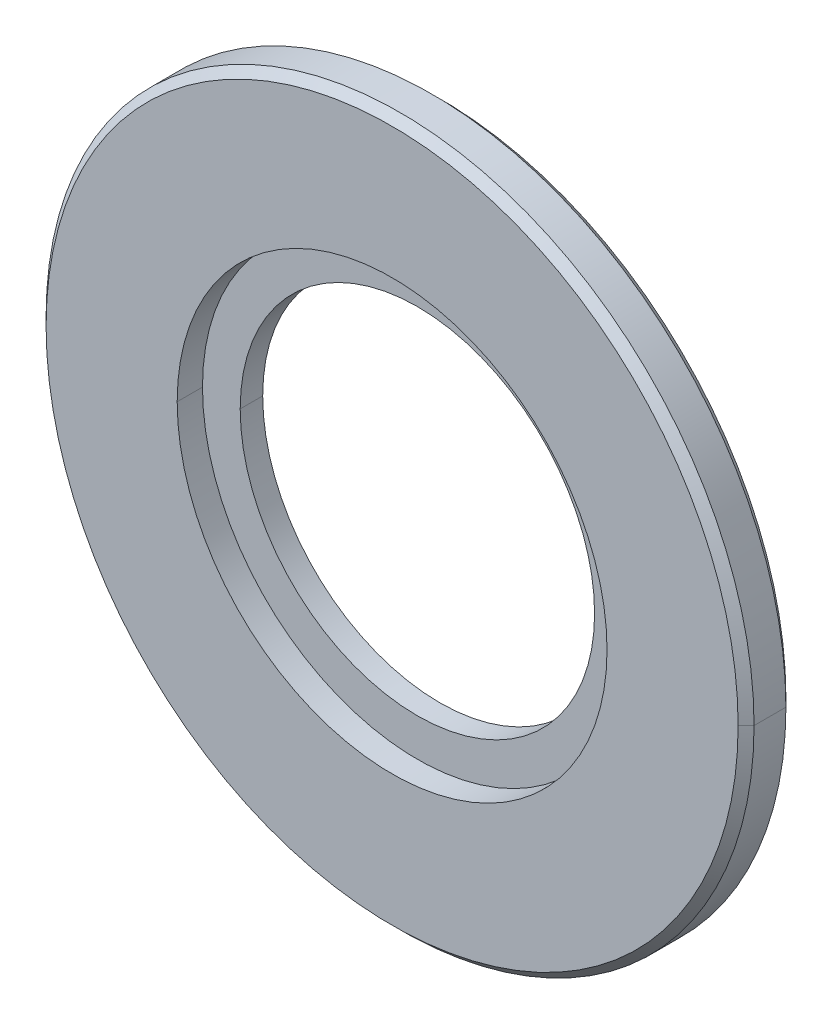
ISO-10303-21;
HEADER;
FILE_DESCRIPTION(('STEP AP214'),'2;1');
FILE_NAME('part.step','',(''),(''),'','','');
FILE_SCHEMA(('AUTOMOTIVE_DESIGN { 1 0 10303 214 1 1 1 1 }'));
ENDSEC;
DATA;
#1=APPLICATION_CONTEXT('core data for automotive mechanical design processes');
#2=APPLICATION_PROTOCOL_DEFINITION('international standard','automotive_design',2000,#1);
#3=PRODUCT_CONTEXT('',#1,'mechanical');
#4=PRODUCT('Part','Part','',(#3));
#5=PRODUCT_RELATED_PRODUCT_CATEGORY('part','',(#4));
#6=PRODUCT_DEFINITION_FORMATION('','',#4);
#7=PRODUCT_DEFINITION_CONTEXT('part definition',#1,'design');
#8=PRODUCT_DEFINITION('design','',#6,#7);
#9=PRODUCT_DEFINITION_SHAPE('','',#8);
#10=(LENGTH_UNIT() NAMED_UNIT(*) SI_UNIT(.MILLI.,.METRE.));
#11=(NAMED_UNIT(*) PLANE_ANGLE_UNIT() SI_UNIT($,.RADIAN.));
#12=(NAMED_UNIT(*) SI_UNIT($,.STERADIAN.) SOLID_ANGLE_UNIT());
#13=UNCERTAINTY_MEASURE_WITH_UNIT(LENGTH_MEASURE(1.E-05),#10,'distance_accuracy_value','');
#14=(GEOMETRIC_REPRESENTATION_CONTEXT(3) GLOBAL_UNCERTAINTY_ASSIGNED_CONTEXT((#13)) GLOBAL_UNIT_ASSIGNED_CONTEXT((#10,
#11,#12)) REPRESENTATION_CONTEXT('',''));
#15=CARTESIAN_POINT('',(0.,0.,0.));
#16=DIRECTION('',(0.,0.,1.));
#17=DIRECTION('',(1.,0.,0.));
#18=AXIS2_PLACEMENT_3D('',#15,#16,#17);
#19=CARTESIAN_POINT('',(0.,0.,0.));
#20=DIRECTION('',(0.,0.,-1.));
#21=DIRECTION('',(-1.,0.,0.));
#22=AXIS2_PLACEMENT_3D('',#19,#20,#21);
#23=CONICAL_SURFACE('',#22,21.7250000000011,0.785398163397448);
#24=DIRECTION('',(0.707106781186573,0.,-0.707106781186522));
#25=VECTOR('',#24,1.);
#26=CARTESIAN_POINT('',(21.7250000000011,0.,0.));
#27=LINE('',#26,#25);
#28=CARTESIAN_POINT('',(21.725,0.,0.));
#29=VERTEX_POINT('',#28);
#30=CARTESIAN_POINT('',(22.2250000000012,0.,-0.499999999999973));
#31=VERTEX_POINT('',#30);
#32=EDGE_CURVE('E146',#29,#31,#27,.T.);
#33=ORIENTED_EDGE('',*,*,#32,.F.);
#34=CARTESIAN_POINT('',(0.,0.,0.));
#35=DIRECTION('',(0.,0.,1.));
#36=DIRECTION('',(1.,0.,0.));
#37=AXIS2_PLACEMENT_3D('',#34,#35,#36);
#38=CIRCLE('',#37,21.7250000000011);
#39=CARTESIAN_POINT('',(-21.725,0.,0.));
#40=VERTEX_POINT('',#39);
#41=EDGE_CURVE('E139',#40,#29,#38,.T.);
#42=ORIENTED_EDGE('',*,*,#41,.F.);
#43=DIRECTION('',(-0.707106781186573,0.,-0.707106781186522));
#44=VECTOR('',#43,1.);
#45=CARTESIAN_POINT('',(-21.7250000000011,0.,0.));
#46=LINE('',#45,#44);
#47=CARTESIAN_POINT('',(-22.225,0.,-0.499999999999973));
#48=VERTEX_POINT('',#47);
#49=EDGE_CURVE('E138',#40,#48,#46,.T.);
#50=ORIENTED_EDGE('',*,*,#49,.T.);
#51=CARTESIAN_POINT('',(0.,0.,-0.499999999999973));
#52=DIRECTION('',(0.,0.,-1.));
#53=DIRECTION('',(1.,0.,0.));
#54=AXIS2_PLACEMENT_3D('',#51,#52,#53);
#55=CIRCLE('',#54,22.2250000000012);
#56=EDGE_CURVE('E11',#31,#48,#55,.T.);
#57=ORIENTED_EDGE('',*,*,#56,.F.);
#58=EDGE_LOOP('',(#33,#42,#50,#57));
#59=FACE_BOUND('',#58,.T.);
#60=ADVANCED_FACE('F16',(#59),#23,.T.);
#61=CARTESIAN_POINT('',(0.,0.,-2.49999999999997));
#62=DIRECTION('',(0.,0.,1.));
#63=DIRECTION('',(1.,0.,0.));
#64=AXIS2_PLACEMENT_3D('',#61,#62,#63);
#65=CONICAL_SURFACE('',#64,22.2250000000012,0.785398163397452);
#66=DIRECTION('',(-0.707106781186576,0.,0.70710678118652));
#67=VECTOR('',#66,1.);
#68=CARTESIAN_POINT('',(-22.2250000000012,0.,-2.49999999999997));
#69=LINE('',#68,#67);
#70=CARTESIAN_POINT('',(-21.725,0.,-3.));
#71=VERTEX_POINT('',#70);
#72=CARTESIAN_POINT('',(-22.225,0.,-2.49999999999997));
#73=VERTEX_POINT('',#72);
#74=EDGE_CURVE('E178',#71,#73,#69,.T.);
#75=ORIENTED_EDGE('',*,*,#74,.F.);
#76=CARTESIAN_POINT('',(0.,0.,-3.));
#77=DIRECTION('',(0.,0.,-1.));
#78=DIRECTION('',(-1.,0.,0.));
#79=AXIS2_PLACEMENT_3D('',#76,#77,#78);
#80=CIRCLE('',#79,21.7250000000011);
#81=CARTESIAN_POINT('',(21.725,0.,-3.));
#82=VERTEX_POINT('',#81);
#83=EDGE_CURVE('E107',#82,#71,#80,.T.);
#84=ORIENTED_EDGE('',*,*,#83,.F.);
#85=DIRECTION('',(0.707106781186576,0.,0.70710678118652));
#86=VECTOR('',#85,1.);
#87=CARTESIAN_POINT('',(22.2250000000012,0.,-2.49999999999997));
#88=LINE('',#87,#86);
#89=CARTESIAN_POINT('',(22.225,0.,-2.49999999999997));
#90=VERTEX_POINT('',#89);
#91=EDGE_CURVE('E134',#82,#90,#88,.T.);
#92=ORIENTED_EDGE('',*,*,#91,.T.);
#93=CARTESIAN_POINT('',(0.,0.,-2.49999999999997));
#94=DIRECTION('',(0.,0.,1.));
#95=DIRECTION('',(-1.,0.,0.));
#96=AXIS2_PLACEMENT_3D('',#93,#94,#95);
#97=CIRCLE('',#96,22.2250000000012);
#98=EDGE_CURVE('E27',#73,#90,#97,.T.);
#99=ORIENTED_EDGE('',*,*,#98,.F.);
#100=EDGE_LOOP('',(#75,#84,#92,#99));
#101=FACE_BOUND('',#100,.T.);
#102=ADVANCED_FACE('F253',(#101),#65,.T.);
#103=CARTESIAN_POINT('',(0.,0.,0.));
#104=DIRECTION('',(0.,0.,1.));
#105=DIRECTION('',(1.,0.,0.));
#106=AXIS2_PLACEMENT_3D('',#103,#104,#105);
#107=CYLINDRICAL_SURFACE('',#106,22.2250000000012);
#108=DIRECTION('',(0.,0.,1.));
#109=VECTOR('',#108,1.);
#110=CARTESIAN_POINT('',(-22.2250000000012,0.,0.));
#111=LINE('',#110,#109);
#112=EDGE_CURVE('E117',#73,#48,#111,.T.);
#113=ORIENTED_EDGE('',*,*,#112,.F.);
#114=ORIENTED_EDGE('',*,*,#98,.T.);
#115=DIRECTION('',(0.,0.,1.));
#116=VECTOR('',#115,1.);
#117=CARTESIAN_POINT('',(22.2250000000012,0.,0.));
#118=LINE('',#117,#116);
#119=EDGE_CURVE('E120',#90,#31,#118,.T.);
#120=ORIENTED_EDGE('',*,*,#119,.T.);
#121=ORIENTED_EDGE('',*,*,#56,.T.);
#122=EDGE_LOOP('',(#113,#114,#120,#121));
#123=FACE_BOUND('',#122,.T.);
#124=ADVANCED_FACE('F116',(#123),#107,.T.);
#125=CARTESIAN_POINT('',(13.493749999999,-1.66533453693773E-13,1.38777878078145E-13));
#126=DIRECTION('',(0.,0.,1.));
#127=DIRECTION('',(0.,-1.,0.));
#128=AXIS2_PLACEMENT_3D('',#125,#126,#127);
#129=PLANE('',#128);
#130=CARTESIAN_POINT('',(0.,0.,0.));
#131=DIRECTION('',(0.,0.,1.));
#132=DIRECTION('',(1.,0.,0.));
#133=AXIS2_PLACEMENT_3D('',#130,#131,#132);
#134=CIRCLE('',#133,13.4937500000007);
#135=CARTESIAN_POINT('',(13.4937500000007,0.,0.));
#136=VERTEX_POINT('',#135);
#137=CARTESIAN_POINT('',(-13.49375,0.,0.));
#138=VERTEX_POINT('',#137);
#139=EDGE_CURVE('E96',#136,#138,#134,.T.);
#140=ORIENTED_EDGE('',*,*,#139,.F.);
#141=CARTESIAN_POINT('',(0.,0.,0.));
#142=DIRECTION('',(0.,0.,1.));
#143=DIRECTION('',(1.,0.,0.));
#144=AXIS2_PLACEMENT_3D('',#141,#142,#143);
#145=CIRCLE('',#144,13.4937500000007);
#146=EDGE_CURVE('E162',#138,#136,#145,.T.);
#147=ORIENTED_EDGE('',*,*,#146,.F.);
#148=EDGE_LOOP('',(#140,#147));
#149=FACE_BOUND('',#148,.T.);
#150=ORIENTED_EDGE('',*,*,#41,.T.);
#151=CARTESIAN_POINT('',(0.,0.,0.));
#152=DIRECTION('',(0.,0.,1.));
#153=DIRECTION('',(1.,0.,0.));
#154=AXIS2_PLACEMENT_3D('',#151,#152,#153);
#155=CIRCLE('',#154,21.7250000000011);
#156=EDGE_CURVE('E154',#29,#40,#155,.T.);
#157=ORIENTED_EDGE('',*,*,#156,.T.);
#158=EDGE_LOOP('',(#150,#157));
#159=FACE_BOUND('',#158,.T.);
#160=ADVANCED_FACE('F211',(#149,#159),#129,.T.);
#161=CARTESIAN_POINT('',(0.,0.,0.));
#162=DIRECTION('',(0.,0.,1.));
#163=DIRECTION('',(1.,0.,0.));
#164=AXIS2_PLACEMENT_3D('',#161,#162,#163);
#165=CYLINDRICAL_SURFACE('',#164,13.4937500000007);
#166=DIRECTION('',(0.,0.,1.));
#167=VECTOR('',#166,1.);
#168=CARTESIAN_POINT('',(-13.4937500000007,0.,0.));
#169=LINE('',#168,#167);
#170=CARTESIAN_POINT('',(-13.49375,0.,-1.58749999999997));
#171=VERTEX_POINT('',#170);
#172=EDGE_CURVE('E166',#171,#138,#169,.T.);
#173=ORIENTED_EDGE('',*,*,#172,.F.);
#174=CARTESIAN_POINT('',(0.,0.,-1.58749999999997));
#175=DIRECTION('',(0.,0.,1.));
#176=DIRECTION('',(1.,0.,0.));
#177=AXIS2_PLACEMENT_3D('',#174,#175,#176);
#178=CIRCLE('',#177,13.4937500000007);
#179=CARTESIAN_POINT('',(13.4937500000007,0.,-1.58749999999997));
#180=VERTEX_POINT('',#179);
#181=EDGE_CURVE('E176',#180,#171,#178,.T.);
#182=ORIENTED_EDGE('',*,*,#181,.F.);
#183=DIRECTION('',(0.,0.,1.));
#184=VECTOR('',#183,1.);
#185=CARTESIAN_POINT('',(13.4937500000007,0.,0.));
#186=LINE('',#185,#184);
#187=EDGE_CURVE('E161',#180,#136,#186,.T.);
#188=ORIENTED_EDGE('',*,*,#187,.T.);
#189=ORIENTED_EDGE('',*,*,#139,.T.);
#190=EDGE_LOOP('',(#173,#182,#188,#189));
#191=FACE_BOUND('',#190,.T.);
#192=ADVANCED_FACE('F208',(#191),#165,.F.);
#193=CARTESIAN_POINT('',(11.1252000000006,1.11022302462516E-13,-1.58749999999975));
#194=DIRECTION('',(0.,0.,1.));
#195=DIRECTION('',(0.,-1.,0.));
#196=AXIS2_PLACEMENT_3D('',#193,#194,#195);
#197=PLANE('',#196);
#198=CARTESIAN_POINT('',(0.,0.,-1.58749999999997));
#199=DIRECTION('',(0.,0.,1.));
#200=DIRECTION('',(1.,0.,0.));
#201=AXIS2_PLACEMENT_3D('',#198,#199,#200);
#202=CIRCLE('',#201,11.1252000000006);
#203=CARTESIAN_POINT('',(11.1252000000006,0.,-1.58749999999997));
#204=VERTEX_POINT('',#203);
#205=CARTESIAN_POINT('',(-11.1252,0.,-1.58749999999997));
#206=VERTEX_POINT('',#205);
#207=EDGE_CURVE('E41',#204,#206,#202,.T.);
#208=ORIENTED_EDGE('',*,*,#207,.F.);
#209=CARTESIAN_POINT('',(0.,0.,-1.58749999999997));
#210=DIRECTION('',(0.,0.,1.));
#211=DIRECTION('',(1.,0.,0.));
#212=AXIS2_PLACEMENT_3D('',#209,#210,#211);
#213=CIRCLE('',#212,11.1252000000006);
#214=EDGE_CURVE('E170',#206,#204,#213,.T.);
#215=ORIENTED_EDGE('',*,*,#214,.F.);
#216=EDGE_LOOP('',(#208,#215));
#217=FACE_BOUND('',#216,.T.);
#218=ORIENTED_EDGE('',*,*,#181,.T.);
#219=CARTESIAN_POINT('',(0.,0.,-1.58749999999997));
#220=DIRECTION('',(0.,0.,1.));
#221=DIRECTION('',(1.,0.,0.));
#222=AXIS2_PLACEMENT_3D('',#219,#220,#221);
#223=CIRCLE('',#222,13.4937500000007);
#224=EDGE_CURVE('E201',#171,#180,#223,.T.);
#225=ORIENTED_EDGE('',*,*,#224,.T.);
#226=EDGE_LOOP('',(#218,#225));
#227=FACE_BOUND('',#226,.T.);
#228=ADVANCED_FACE('F238',(#217,#227),#197,.T.);
#229=CARTESIAN_POINT('',(0.,0.,0.));
#230=DIRECTION('',(0.,0.,1.));
#231=DIRECTION('',(1.,0.,0.));
#232=AXIS2_PLACEMENT_3D('',#229,#230,#231);
#233=CYLINDRICAL_SURFACE('',#232,11.1252000000006);
#234=DIRECTION('',(0.,0.,1.));
#235=VECTOR('',#234,1.);
#236=CARTESIAN_POINT('',(-11.1252000000006,0.,0.));
#237=LINE('',#236,#235);
#238=CARTESIAN_POINT('',(-11.1252,0.,-3.));
#239=VERTEX_POINT('',#238);
#240=EDGE_CURVE('E160',#239,#206,#237,.T.);
#241=ORIENTED_EDGE('',*,*,#240,.F.);
#242=CARTESIAN_POINT('',(0.,0.,-3.));
#243=DIRECTION('',(0.,0.,1.));
#244=DIRECTION('',(1.,0.,0.));
#245=AXIS2_PLACEMENT_3D('',#242,#243,#244);
#246=CIRCLE('',#245,11.1252000000006);
#247=CARTESIAN_POINT('',(11.1252000000006,0.,-3.));
#248=VERTEX_POINT('',#247);
#249=EDGE_CURVE('E20',#248,#239,#246,.T.);
#250=ORIENTED_EDGE('',*,*,#249,.F.);
#251=DIRECTION('',(0.,0.,1.));
#252=VECTOR('',#251,1.);
#253=CARTESIAN_POINT('',(11.1252000000006,0.,0.));
#254=LINE('',#253,#252);
#255=EDGE_CURVE('E167',#248,#204,#254,.T.);
#256=ORIENTED_EDGE('',*,*,#255,.T.);
#257=ORIENTED_EDGE('',*,*,#207,.T.);
#258=EDGE_LOOP('',(#241,#250,#256,#257));
#259=FACE_BOUND('',#258,.T.);
#260=ADVANCED_FACE('F240',(#259),#233,.F.);
#261=CARTESIAN_POINT('',(22.225,-3.88578058618805E-13,-3.));
#262=DIRECTION('',(0.,0.,-1.));
#263=DIRECTION('',(-1.,0.,0.));
#264=AXIS2_PLACEMENT_3D('',#261,#262,#263);
#265=PLANE('',#264);
#266=ORIENTED_EDGE('',*,*,#249,.T.);
#267=CARTESIAN_POINT('',(0.,0.,-3.));
#268=DIRECTION('',(0.,0.,1.));
#269=DIRECTION('',(1.,0.,0.));
#270=AXIS2_PLACEMENT_3D('',#267,#268,#269);
#271=CIRCLE('',#270,11.1252000000006);
#272=EDGE_CURVE('E158',#239,#248,#271,.T.);
#273=ORIENTED_EDGE('',*,*,#272,.T.);
#274=EDGE_LOOP('',(#266,#273));
#275=FACE_BOUND('',#274,.T.);
#276=ORIENTED_EDGE('',*,*,#83,.T.);
#277=CARTESIAN_POINT('',(0.,0.,-3.));
#278=DIRECTION('',(0.,0.,-1.));
#279=DIRECTION('',(-1.,0.,0.));
#280=AXIS2_PLACEMENT_3D('',#277,#278,#279);
#281=CIRCLE('',#280,21.7250000000011);
#282=EDGE_CURVE('E144',#71,#82,#281,.T.);
#283=ORIENTED_EDGE('',*,*,#282,.T.);
#284=EDGE_LOOP('',(#276,#283));
#285=FACE_BOUND('',#284,.T.);
#286=ADVANCED_FACE('F247',(#275,#285),#265,.T.);
#287=CARTESIAN_POINT('',(0.,0.,0.));
#288=DIRECTION('',(0.,0.,1.));
#289=DIRECTION('',(1.,0.,0.));
#290=AXIS2_PLACEMENT_3D('',#287,#288,#289);
#291=CYLINDRICAL_SURFACE('',#290,11.1252000000006);
#292=ORIENTED_EDGE('',*,*,#272,.F.);
#293=ORIENTED_EDGE('',*,*,#240,.T.);
#294=ORIENTED_EDGE('',*,*,#214,.T.);
#295=ORIENTED_EDGE('',*,*,#255,.F.);
#296=EDGE_LOOP('',(#292,#293,#294,#295));
#297=FACE_BOUND('',#296,.T.);
#298=ADVANCED_FACE('F237',(#297),#291,.F.);
#299=CARTESIAN_POINT('',(0.,0.,0.));
#300=DIRECTION('',(0.,0.,1.));
#301=DIRECTION('',(1.,0.,0.));
#302=AXIS2_PLACEMENT_3D('',#299,#300,#301);
#303=CYLINDRICAL_SURFACE('',#302,13.4937500000007);
#304=ORIENTED_EDGE('',*,*,#224,.F.);
#305=ORIENTED_EDGE('',*,*,#172,.T.);
#306=ORIENTED_EDGE('',*,*,#146,.T.);
#307=ORIENTED_EDGE('',*,*,#187,.F.);
#308=EDGE_LOOP('',(#304,#305,#306,#307));
#309=FACE_BOUND('',#308,.T.);
#310=ADVANCED_FACE('F214',(#309),#303,.F.);
#311=CARTESIAN_POINT('',(0.,0.,0.));
#312=DIRECTION('',(0.,0.,1.));
#313=DIRECTION('',(1.,0.,0.));
#314=AXIS2_PLACEMENT_3D('',#311,#312,#313);
#315=CYLINDRICAL_SURFACE('',#314,22.2250000000012);
#316=CARTESIAN_POINT('',(0.,0.,-2.49999999999997));
#317=DIRECTION('',(0.,0.,1.));
#318=DIRECTION('',(-1.,0.,0.));
#319=AXIS2_PLACEMENT_3D('',#316,#317,#318);
#320=CIRCLE('',#319,22.2250000000012);
#321=EDGE_CURVE('E131',#90,#73,#320,.T.);
#322=ORIENTED_EDGE('',*,*,#321,.T.);
#323=ORIENTED_EDGE('',*,*,#112,.T.);
#324=CARTESIAN_POINT('',(0.,0.,-0.499999999999973));
#325=DIRECTION('',(0.,0.,-1.));
#326=DIRECTION('',(1.,0.,0.));
#327=AXIS2_PLACEMENT_3D('',#324,#325,#326);
#328=CIRCLE('',#327,22.2250000000012);
#329=EDGE_CURVE('E128',#48,#31,#328,.T.);
#330=ORIENTED_EDGE('',*,*,#329,.T.);
#331=ORIENTED_EDGE('',*,*,#119,.F.);
#332=EDGE_LOOP('',(#322,#323,#330,#331));
#333=FACE_BOUND('',#332,.T.);
#334=ADVANCED_FACE('F126',(#333),#315,.T.);
#335=CARTESIAN_POINT('',(0.,0.,-2.49999999999997));
#336=DIRECTION('',(0.,0.,1.));
#337=DIRECTION('',(1.,0.,0.));
#338=AXIS2_PLACEMENT_3D('',#335,#336,#337);
#339=CONICAL_SURFACE('',#338,22.2250000000012,0.785398163397452);
#340=ORIENTED_EDGE('',*,*,#282,.F.);
#341=ORIENTED_EDGE('',*,*,#74,.T.);
#342=ORIENTED_EDGE('',*,*,#321,.F.);
#343=ORIENTED_EDGE('',*,*,#91,.F.);
#344=EDGE_LOOP('',(#340,#341,#342,#343));
#345=FACE_BOUND('',#344,.T.);
#346=ADVANCED_FACE('F263',(#345),#339,.T.);
#347=CARTESIAN_POINT('',(0.,0.,0.));
#348=DIRECTION('',(0.,0.,-1.));
#349=DIRECTION('',(-1.,0.,0.));
#350=AXIS2_PLACEMENT_3D('',#347,#348,#349);
#351=CONICAL_SURFACE('',#350,21.7250000000011,0.785398163397448);
#352=ORIENTED_EDGE('',*,*,#156,.F.);
#353=ORIENTED_EDGE('',*,*,#32,.T.);
#354=ORIENTED_EDGE('',*,*,#329,.F.);
#355=ORIENTED_EDGE('',*,*,#49,.F.);
#356=EDGE_LOOP('',(#352,#353,#354,#355));
#357=FACE_BOUND('',#356,.T.);
#358=ADVANCED_FACE('F18',(#357),#351,.T.);
#359=CLOSED_SHELL('',(#60,#102,#124,#160,#192,#228,#260,#286,#298,#310,#334,#346,#358));
#360=MANIFOLD_SOLID_BREP('B1',#359);
#361=ADVANCED_BREP_SHAPE_REPRESENTATION('',(#18,#360),#14);
#362=SHAPE_DEFINITION_REPRESENTATION(#9,#361);
ENDSEC;
END-ISO-10303-21;
